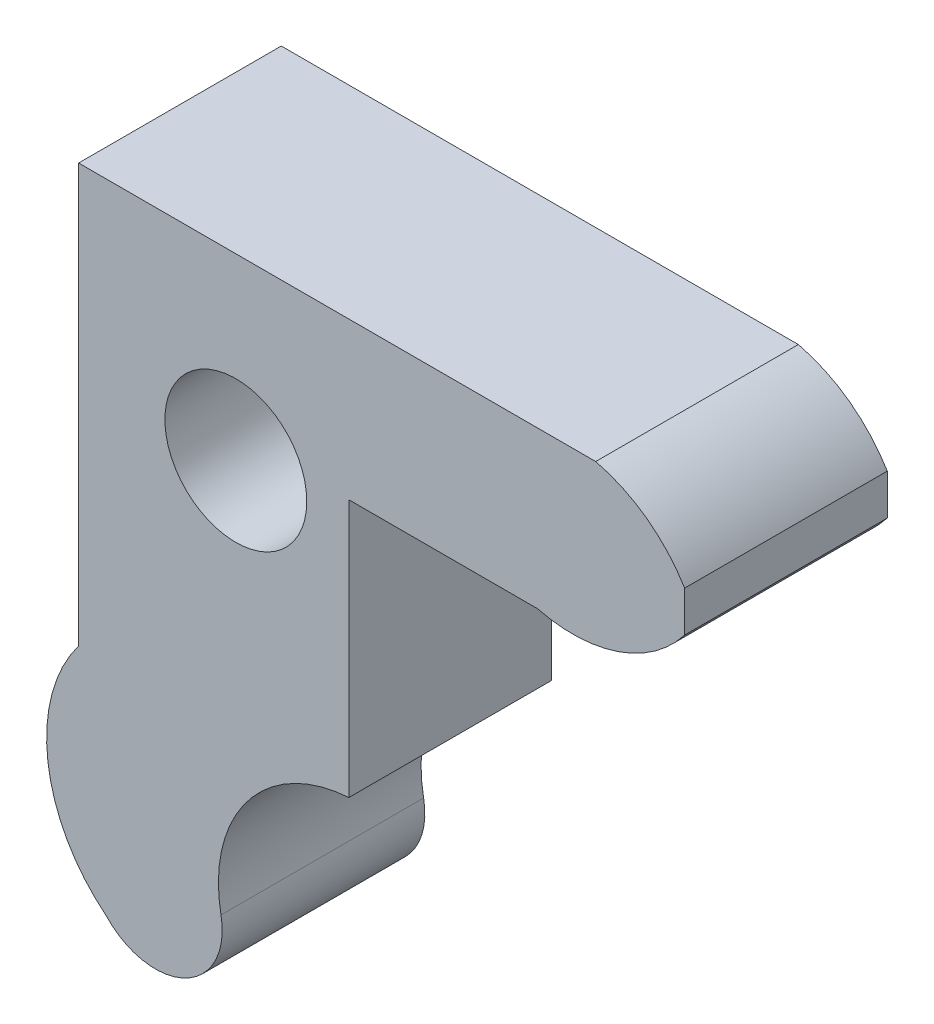
ISO-10303-21;
HEADER;
FILE_DESCRIPTION(('STEP AP214'),'2;1');
FILE_NAME('part.step','',(''),(''),'','','');
FILE_SCHEMA(('AUTOMOTIVE_DESIGN { 1 0 10303 214 1 1 1 1 }'));
ENDSEC;
DATA;
#1=APPLICATION_CONTEXT('core data for automotive mechanical design processes');
#2=APPLICATION_PROTOCOL_DEFINITION('international standard','automotive_design',2000,#1);
#3=PRODUCT_CONTEXT('',#1,'mechanical');
#4=PRODUCT('Part','Part','',(#3));
#5=PRODUCT_RELATED_PRODUCT_CATEGORY('part','',(#4));
#6=PRODUCT_DEFINITION_FORMATION('','',#4);
#7=PRODUCT_DEFINITION_CONTEXT('part definition',#1,'design');
#8=PRODUCT_DEFINITION('design','',#6,#7);
#9=PRODUCT_DEFINITION_SHAPE('','',#8);
#10=(LENGTH_UNIT() NAMED_UNIT(*) SI_UNIT(.MILLI.,.METRE.));
#11=(NAMED_UNIT(*) PLANE_ANGLE_UNIT() SI_UNIT($,.RADIAN.));
#12=(NAMED_UNIT(*) SI_UNIT($,.STERADIAN.) SOLID_ANGLE_UNIT());
#13=UNCERTAINTY_MEASURE_WITH_UNIT(LENGTH_MEASURE(1.E-05),#10,'distance_accuracy_value','');
#14=(GEOMETRIC_REPRESENTATION_CONTEXT(3) GLOBAL_UNCERTAINTY_ASSIGNED_CONTEXT((#13)) GLOBAL_UNIT_ASSIGNED_CONTEXT((#10,
#11,#12)) REPRESENTATION_CONTEXT('',''));
#15=CARTESIAN_POINT('',(0.,0.,0.));
#16=DIRECTION('',(0.,0.,1.));
#17=DIRECTION('',(1.,0.,0.));
#18=AXIS2_PLACEMENT_3D('',#15,#16,#17);
#19=CARTESIAN_POINT('',(-0.885520710545655,-9.91418006301445,3.));
#20=DIRECTION('',(0.,0.,1.));
#21=DIRECTION('',(1.,0.,0.));
#22=AXIS2_PLACEMENT_3D('',#19,#20,#21);
#23=PLANE('',#22);
#24=CARTESIAN_POINT('',(-0.885520710545655,-9.91418006301445,3.));
#25=DIRECTION('',(0.,0.,1.));
#26=DIRECTION('',(1.,0.,0.));
#27=AXIS2_PLACEMENT_3D('',#24,#25,#26);
#28=CIRCLE('',#27,4.71592602186394);
#29=CARTESIAN_POINT('',(-4.65466217372821,-7.07983165919895,3.));
#30=VERTEX_POINT('',#29);
#31=CARTESIAN_POINT('',(-3.83002531609919,-13.5979079128382,3.));
#32=VERTEX_POINT('',#31);
#33=EDGE_CURVE('E161',#30,#32,#28,.T.);
#34=ORIENTED_EDGE('',*,*,#33,.T.);
#35=CARTESIAN_POINT('',(-2.38109806838179,-12.2515628020871,3.));
#36=DIRECTION('',(0.,0.,1.));
#37=DIRECTION('',(1.,0.,0.));
#38=AXIS2_PLACEMENT_3D('',#35,#36,#37);
#39=CIRCLE('',#38,1.97788658077794);
#40=CARTESIAN_POINT('',(-0.439769501258131,-11.8730410446,3.));
#41=VERTEX_POINT('',#40);
#42=EDGE_CURVE('E99',#32,#41,#39,.T.);
#43=ORIENTED_EDGE('',*,*,#42,.T.);
#44=CARTESIAN_POINT('',(3.60750377075866,-11.0839005467481,3.));
#45=DIRECTION('',(0.,0.,-1.));
#46=DIRECTION('',(-1.,0.,0.));
#47=AXIS2_PLACEMENT_3D('',#44,#45,#46);
#48=CIRCLE('',#47,4.12348925835044);
#49=CARTESIAN_POINT('',(3.34533782627179,-6.9687538080178,3.));
#50=VERTEX_POINT('',#49);
#51=EDGE_CURVE('E182',#41,#50,#48,.T.);
#52=ORIENTED_EDGE('',*,*,#51,.T.);
#53=DIRECTION('',(0.,1.,0.));
#54=VECTOR('',#53,1.);
#55=CARTESIAN_POINT('',(3.34533782627179,0.667243239804023,3.));
#56=LINE('',#55,#54);
#57=CARTESIAN_POINT('',(3.34533782627179,0.667243239804023,3.));
#58=VERTEX_POINT('',#57);
#59=EDGE_CURVE('E201',#50,#58,#56,.T.);
#60=ORIENTED_EDGE('',*,*,#59,.T.);
#61=DIRECTION('',(1.,0.,0.));
#62=VECTOR('',#61,1.);
#63=CARTESIAN_POINT('',(8.92787451809538,0.667243239804023,3.));
#64=LINE('',#63,#62);
#65=CARTESIAN_POINT('',(8.92787451809538,0.667243239804024,3.));
#66=VERTEX_POINT('',#65);
#67=EDGE_CURVE('E198',#58,#66,#64,.T.);
#68=ORIENTED_EDGE('',*,*,#67,.T.);
#69=CARTESIAN_POINT('',(9.96942852923801,4.7254002990365,3.));
#70=DIRECTION('',(0.,0.,1.));
#71=DIRECTION('',(1.,0.,0.));
#72=AXIS2_PLACEMENT_3D('',#69,#70,#71);
#73=CIRCLE('',#72,4.18968656053477);
#74=CARTESIAN_POINT('',(13.2887402103993,2.16890984553738,3.));
#75=VERTEX_POINT('',#74);
#76=EDGE_CURVE('E200',#66,#75,#73,.T.);
#77=ORIENTED_EDGE('',*,*,#76,.T.);
#78=DIRECTION('',(0.,1.,0.));
#79=VECTOR('',#78,1.);
#80=CARTESIAN_POINT('',(13.2887402103993,3.37273309343224,3.));
#81=LINE('',#80,#79);
#82=CARTESIAN_POINT('',(13.2887402103993,3.37273309343224,3.));
#83=VERTEX_POINT('',#82);
#84=EDGE_CURVE('E124',#75,#83,#81,.T.);
#85=ORIENTED_EDGE('',*,*,#84,.T.);
#86=CARTESIAN_POINT('',(9.65557150366524,1.17481381956794,3.));
#87=DIRECTION('',(0.,0.,1.));
#88=DIRECTION('',(-1.,0.,0.));
#89=AXIS2_PLACEMENT_3D('',#86,#87,#88);
#90=CIRCLE('',#89,4.24626470983799);
#91=CARTESIAN_POINT('',(10.6551453191726,5.30175168842028,3.));
#92=VERTEX_POINT('',#91);
#93=EDGE_CURVE('E118',#83,#92,#90,.T.);
#94=ORIENTED_EDGE('',*,*,#93,.T.);
#95=DIRECTION('',(-1.,0.,0.));
#96=VECTOR('',#95,1.);
#97=CARTESIAN_POINT('',(-4.65466217372821,5.30175168842028,3.));
#98=LINE('',#97,#96);
#99=CARTESIAN_POINT('',(-4.65466217372821,5.30175168842028,3.));
#100=VERTEX_POINT('',#99);
#101=EDGE_CURVE('E122',#92,#100,#98,.T.);
#102=ORIENTED_EDGE('',*,*,#101,.T.);
#103=DIRECTION('',(0.,-1.,0.));
#104=VECTOR('',#103,1.);
#105=CARTESIAN_POINT('',(-4.65466217372821,-7.07983165919895,3.));
#106=LINE('',#105,#104);
#107=EDGE_CURVE('E50',#100,#30,#106,.T.);
#108=ORIENTED_EDGE('',*,*,#107,.T.);
#109=EDGE_LOOP('',(#34,#43,#52,#60,#68,#77,#85,#94,#102,#108));
#110=FACE_BOUND('',#109,.T.);
#111=CARTESIAN_POINT('',(0.,0.,3.));
#112=DIRECTION('',(0.,0.,1.));
#113=DIRECTION('',(1.,0.,0.));
#114=AXIS2_PLACEMENT_3D('',#111,#112,#113);
#115=CIRCLE('',#114,2.1);
#116=CARTESIAN_POINT('',(2.1,0.,3.));
#117=VERTEX_POINT('',#116);
#118=EDGE_CURVE('E146',#117,#117,#115,.T.);
#119=ORIENTED_EDGE('',*,*,#118,.F.);
#120=EDGE_LOOP('',(#119));
#121=FACE_BOUND('',#120,.T.);
#122=ADVANCED_FACE('F33',(#110,#121),#23,.T.);
#123=CARTESIAN_POINT('',(-0.885520710545655,-9.91418006301445,-3.));
#124=DIRECTION('',(0.,0.,1.));
#125=DIRECTION('',(1.,0.,0.));
#126=AXIS2_PLACEMENT_3D('',#123,#124,#125);
#127=PLANE('',#126);
#128=CARTESIAN_POINT('',(-0.885520710545655,-9.91418006301445,-3.));
#129=DIRECTION('',(0.,0.,1.));
#130=DIRECTION('',(1.,0.,0.));
#131=AXIS2_PLACEMENT_3D('',#128,#129,#130);
#132=CIRCLE('',#131,4.71592602186394);
#133=CARTESIAN_POINT('',(-4.65466217372821,-7.07983165919895,-3.));
#134=VERTEX_POINT('',#133);
#135=CARTESIAN_POINT('',(-3.83002531609919,-13.5979079128382,-3.));
#136=VERTEX_POINT('',#135);
#137=EDGE_CURVE('E142',#134,#136,#132,.T.);
#138=ORIENTED_EDGE('',*,*,#137,.F.);
#139=DIRECTION('',(0.,-1.,0.));
#140=VECTOR('',#139,1.);
#141=CARTESIAN_POINT('',(-4.65466217372821,-7.07983165919895,-3.));
#142=LINE('',#141,#140);
#143=CARTESIAN_POINT('',(-4.65466217372821,5.30175168842028,-3.));
#144=VERTEX_POINT('',#143);
#145=EDGE_CURVE('E91',#144,#134,#142,.T.);
#146=ORIENTED_EDGE('',*,*,#145,.F.);
#147=DIRECTION('',(-1.,0.,0.));
#148=VECTOR('',#147,1.);
#149=CARTESIAN_POINT('',(-4.65466217372821,5.30175168842028,-3.));
#150=LINE('',#149,#148);
#151=CARTESIAN_POINT('',(10.6551453191726,5.30175168842028,-3.));
#152=VERTEX_POINT('',#151);
#153=EDGE_CURVE('E85',#152,#144,#150,.T.);
#154=ORIENTED_EDGE('',*,*,#153,.F.);
#155=CARTESIAN_POINT('',(9.65557150366524,1.17481381956794,-3.));
#156=DIRECTION('',(0.,0.,1.));
#157=DIRECTION('',(-1.,0.,0.));
#158=AXIS2_PLACEMENT_3D('',#155,#156,#157);
#159=CIRCLE('',#158,4.24626470983799);
#160=CARTESIAN_POINT('',(13.2887402103993,3.37273309343224,-3.));
#161=VERTEX_POINT('',#160);
#162=EDGE_CURVE('E132',#161,#152,#159,.T.);
#163=ORIENTED_EDGE('',*,*,#162,.F.);
#164=DIRECTION('',(0.,1.,0.));
#165=VECTOR('',#164,1.);
#166=CARTESIAN_POINT('',(13.2887402103993,3.37273309343224,-3.));
#167=LINE('',#166,#165);
#168=CARTESIAN_POINT('',(13.2887402103993,2.16890984553738,-3.));
#169=VERTEX_POINT('',#168);
#170=EDGE_CURVE('E156',#169,#161,#167,.T.);
#171=ORIENTED_EDGE('',*,*,#170,.F.);
#172=CARTESIAN_POINT('',(9.96942852923801,4.7254002990365,-3.));
#173=DIRECTION('',(0.,0.,1.));
#174=DIRECTION('',(1.,0.,0.));
#175=AXIS2_PLACEMENT_3D('',#172,#173,#174);
#176=CIRCLE('',#175,4.18968656053477);
#177=CARTESIAN_POINT('',(8.92787451809538,0.667243239804024,-3.));
#178=VERTEX_POINT('',#177);
#179=EDGE_CURVE('E154',#178,#169,#176,.T.);
#180=ORIENTED_EDGE('',*,*,#179,.F.);
#181=DIRECTION('',(1.,0.,0.));
#182=VECTOR('',#181,1.);
#183=CARTESIAN_POINT('',(8.92787451809538,0.667243239804023,-3.));
#184=LINE('',#183,#182);
#185=CARTESIAN_POINT('',(3.34533782627179,0.667243239804023,-3.));
#186=VERTEX_POINT('',#185);
#187=EDGE_CURVE('E152',#186,#178,#184,.T.);
#188=ORIENTED_EDGE('',*,*,#187,.F.);
#189=DIRECTION('',(0.,1.,0.));
#190=VECTOR('',#189,1.);
#191=CARTESIAN_POINT('',(3.34533782627179,0.667243239804023,-3.));
#192=LINE('',#191,#190);
#193=CARTESIAN_POINT('',(3.34533782627179,-6.9687538080178,-3.));
#194=VERTEX_POINT('',#193);
#195=EDGE_CURVE('E150',#194,#186,#192,.T.);
#196=ORIENTED_EDGE('',*,*,#195,.F.);
#197=CARTESIAN_POINT('',(3.60750377075866,-11.0839005467481,-3.));
#198=DIRECTION('',(0.,0.,-1.));
#199=DIRECTION('',(-1.,0.,0.));
#200=AXIS2_PLACEMENT_3D('',#197,#198,#199);
#201=CIRCLE('',#200,4.12348925835044);
#202=CARTESIAN_POINT('',(-0.439769501258131,-11.8730410446,-3.));
#203=VERTEX_POINT('',#202);
#204=EDGE_CURVE('E148',#203,#194,#201,.T.);
#205=ORIENTED_EDGE('',*,*,#204,.F.);
#206=CARTESIAN_POINT('',(-2.38109806838179,-12.2515628020871,-3.));
#207=DIRECTION('',(0.,0.,1.));
#208=DIRECTION('',(1.,0.,0.));
#209=AXIS2_PLACEMENT_3D('',#206,#207,#208);
#210=CIRCLE('',#209,1.97788658077794);
#211=EDGE_CURVE('E145',#136,#203,#210,.T.);
#212=ORIENTED_EDGE('',*,*,#211,.F.);
#213=EDGE_LOOP('',(#138,#146,#154,#163,#171,#180,#188,#196,#205,#212));
#214=FACE_BOUND('',#213,.T.);
#215=CARTESIAN_POINT('',(0.,0.,-3.));
#216=DIRECTION('',(0.,0.,1.));
#217=DIRECTION('',(1.,0.,0.));
#218=AXIS2_PLACEMENT_3D('',#215,#216,#217);
#219=CIRCLE('',#218,2.1);
#220=CARTESIAN_POINT('',(2.1,0.,-3.));
#221=VERTEX_POINT('',#220);
#222=EDGE_CURVE('E209',#221,#221,#219,.T.);
#223=ORIENTED_EDGE('',*,*,#222,.T.);
#224=EDGE_LOOP('',(#223));
#225=FACE_BOUND('',#224,.T.);
#226=ADVANCED_FACE('F186',(#214,#225),#127,.F.);
#227=CARTESIAN_POINT('',(-0.885520710545655,-9.91418006301445,3.));
#228=DIRECTION('',(0.,0.,-1.));
#229=DIRECTION('',(-1.,0.,0.));
#230=AXIS2_PLACEMENT_3D('',#227,#228,#229);
#231=CYLINDRICAL_SURFACE('',#230,4.71592602186394);
#232=ORIENTED_EDGE('',*,*,#137,.T.);
#233=DIRECTION('',(0.,0.,-1.));
#234=VECTOR('',#233,1.);
#235=CARTESIAN_POINT('',(-3.83002531609919,-13.5979079128382,3.));
#236=LINE('',#235,#234);
#237=EDGE_CURVE('E11',#32,#136,#236,.T.);
#238=ORIENTED_EDGE('',*,*,#237,.F.);
#239=ORIENTED_EDGE('',*,*,#33,.F.);
#240=DIRECTION('',(0.,0.,-1.));
#241=VECTOR('',#240,1.);
#242=CARTESIAN_POINT('',(-4.65466217372821,-7.07983165919895,3.));
#243=LINE('',#242,#241);
#244=EDGE_CURVE('E138',#30,#134,#243,.T.);
#245=ORIENTED_EDGE('',*,*,#244,.T.);
#246=EDGE_LOOP('',(#232,#238,#239,#245));
#247=FACE_BOUND('',#246,.T.);
#248=ADVANCED_FACE('F35',(#247),#231,.T.);
#249=CARTESIAN_POINT('',(-2.38109806838179,-12.2515628020871,3.));
#250=DIRECTION('',(0.,0.,-1.));
#251=DIRECTION('',(-1.,0.,0.));
#252=AXIS2_PLACEMENT_3D('',#249,#250,#251);
#253=CYLINDRICAL_SURFACE('',#252,1.97788658077794);
#254=ORIENTED_EDGE('',*,*,#211,.T.);
#255=DIRECTION('',(0.,0.,-1.));
#256=VECTOR('',#255,1.);
#257=CARTESIAN_POINT('',(-0.439769501258131,-11.8730410446,3.));
#258=LINE('',#257,#256);
#259=EDGE_CURVE('E42',#41,#203,#258,.T.);
#260=ORIENTED_EDGE('',*,*,#259,.F.);
#261=ORIENTED_EDGE('',*,*,#42,.F.);
#262=ORIENTED_EDGE('',*,*,#237,.T.);
#263=EDGE_LOOP('',(#254,#260,#261,#262));
#264=FACE_BOUND('',#263,.T.);
#265=ADVANCED_FACE('F245',(#264),#253,.T.);
#266=CARTESIAN_POINT('',(3.60750377075866,-11.0839005467481,3.));
#267=DIRECTION('',(0.,0.,-1.));
#268=DIRECTION('',(-1.,0.,0.));
#269=AXIS2_PLACEMENT_3D('',#266,#267,#268);
#270=CYLINDRICAL_SURFACE('',#269,4.12348925835044);
#271=ORIENTED_EDGE('',*,*,#204,.T.);
#272=DIRECTION('',(0.,0.,-1.));
#273=VECTOR('',#272,1.);
#274=CARTESIAN_POINT('',(3.34533782627179,-6.9687538080178,3.));
#275=LINE('',#274,#273);
#276=EDGE_CURVE('E174',#50,#194,#275,.T.);
#277=ORIENTED_EDGE('',*,*,#276,.F.);
#278=ORIENTED_EDGE('',*,*,#51,.F.);
#279=ORIENTED_EDGE('',*,*,#259,.T.);
#280=EDGE_LOOP('',(#271,#277,#278,#279));
#281=FACE_BOUND('',#280,.T.);
#282=ADVANCED_FACE('F180',(#281),#270,.F.);
#283=CARTESIAN_POINT('',(3.34533782627179,0.667243239804023,3.));
#284=DIRECTION('',(-1.,0.,0.));
#285=DIRECTION('',(0.,-1.,0.));
#286=AXIS2_PLACEMENT_3D('',#283,#284,#285);
#287=PLANE('',#286);
#288=ORIENTED_EDGE('',*,*,#195,.T.);
#289=DIRECTION('',(0.,0.,-1.));
#290=VECTOR('',#289,1.);
#291=CARTESIAN_POINT('',(3.34533782627179,0.667243239804023,3.));
#292=LINE('',#291,#290);
#293=EDGE_CURVE('E171',#58,#186,#292,.T.);
#294=ORIENTED_EDGE('',*,*,#293,.F.);
#295=ORIENTED_EDGE('',*,*,#59,.F.);
#296=ORIENTED_EDGE('',*,*,#276,.T.);
#297=EDGE_LOOP('',(#288,#294,#295,#296));
#298=FACE_BOUND('',#297,.T.);
#299=ADVANCED_FACE('F192',(#298),#287,.F.);
#300=CARTESIAN_POINT('',(8.92787451809538,0.667243239804023,3.));
#301=DIRECTION('',(0.,1.,0.));
#302=DIRECTION('',(-1.,0.,0.));
#303=AXIS2_PLACEMENT_3D('',#300,#301,#302);
#304=PLANE('',#303);
#305=ORIENTED_EDGE('',*,*,#187,.T.);
#306=DIRECTION('',(0.,0.,-1.));
#307=VECTOR('',#306,1.);
#308=CARTESIAN_POINT('',(8.92787451809538,0.667243239804024,3.));
#309=LINE('',#308,#307);
#310=EDGE_CURVE('E168',#66,#178,#309,.T.);
#311=ORIENTED_EDGE('',*,*,#310,.F.);
#312=ORIENTED_EDGE('',*,*,#67,.F.);
#313=ORIENTED_EDGE('',*,*,#293,.T.);
#314=EDGE_LOOP('',(#305,#311,#312,#313));
#315=FACE_BOUND('',#314,.T.);
#316=ADVANCED_FACE('F196',(#315),#304,.F.);
#317=CARTESIAN_POINT('',(9.96942852923801,4.7254002990365,3.));
#318=DIRECTION('',(0.,0.,-1.));
#319=DIRECTION('',(-1.,0.,0.));
#320=AXIS2_PLACEMENT_3D('',#317,#318,#319);
#321=CYLINDRICAL_SURFACE('',#320,4.18968656053477);
#322=ORIENTED_EDGE('',*,*,#179,.T.);
#323=DIRECTION('',(0.,0.,-1.));
#324=VECTOR('',#323,1.);
#325=CARTESIAN_POINT('',(13.2887402103993,2.16890984553738,3.));
#326=LINE('',#325,#324);
#327=EDGE_CURVE('E165',#75,#169,#326,.T.);
#328=ORIENTED_EDGE('',*,*,#327,.F.);
#329=ORIENTED_EDGE('',*,*,#76,.F.);
#330=ORIENTED_EDGE('',*,*,#310,.T.);
#331=EDGE_LOOP('',(#322,#328,#329,#330));
#332=FACE_BOUND('',#331,.T.);
#333=ADVANCED_FACE('F235',(#332),#321,.T.);
#334=CARTESIAN_POINT('',(13.2887402103993,3.37273309343224,3.));
#335=DIRECTION('',(-1.,0.,0.));
#336=DIRECTION('',(0.,-1.,0.));
#337=AXIS2_PLACEMENT_3D('',#334,#335,#336);
#338=PLANE('',#337);
#339=ORIENTED_EDGE('',*,*,#170,.T.);
#340=DIRECTION('',(0.,0.,-1.));
#341=VECTOR('',#340,1.);
#342=CARTESIAN_POINT('',(13.2887402103993,3.37273309343224,3.));
#343=LINE('',#342,#341);
#344=EDGE_CURVE('E133',#83,#161,#343,.T.);
#345=ORIENTED_EDGE('',*,*,#344,.F.);
#346=ORIENTED_EDGE('',*,*,#84,.F.);
#347=ORIENTED_EDGE('',*,*,#327,.T.);
#348=EDGE_LOOP('',(#339,#345,#346,#347));
#349=FACE_BOUND('',#348,.T.);
#350=ADVANCED_FACE('F232',(#349),#338,.F.);
#351=CARTESIAN_POINT('',(9.65557150366524,1.17481381956794,3.));
#352=DIRECTION('',(0.,0.,-1.));
#353=DIRECTION('',(-1.,0.,0.));
#354=AXIS2_PLACEMENT_3D('',#351,#352,#353);
#355=CYLINDRICAL_SURFACE('',#354,4.24626470983799);
#356=ORIENTED_EDGE('',*,*,#162,.T.);
#357=DIRECTION('',(0.,0.,-1.));
#358=VECTOR('',#357,1.);
#359=CARTESIAN_POINT('',(10.6551453191726,5.30175168842028,3.));
#360=LINE('',#359,#358);
#361=EDGE_CURVE('E129',#92,#152,#360,.T.);
#362=ORIENTED_EDGE('',*,*,#361,.F.);
#363=ORIENTED_EDGE('',*,*,#93,.F.);
#364=ORIENTED_EDGE('',*,*,#344,.T.);
#365=EDGE_LOOP('',(#356,#362,#363,#364));
#366=FACE_BOUND('',#365,.T.);
#367=ADVANCED_FACE('F130',(#366),#355,.T.);
#368=CARTESIAN_POINT('',(-4.65466217372821,5.30175168842028,3.));
#369=DIRECTION('',(0.,-1.,0.));
#370=DIRECTION('',(0.,0.,-1.));
#371=AXIS2_PLACEMENT_3D('',#368,#369,#370);
#372=PLANE('',#371);
#373=ORIENTED_EDGE('',*,*,#153,.T.);
#374=DIRECTION('',(0.,0.,-1.));
#375=VECTOR('',#374,1.);
#376=CARTESIAN_POINT('',(-4.65466217372821,5.30175168842028,3.));
#377=LINE('',#376,#375);
#378=EDGE_CURVE('E134',#100,#144,#377,.T.);
#379=ORIENTED_EDGE('',*,*,#378,.F.);
#380=ORIENTED_EDGE('',*,*,#101,.F.);
#381=ORIENTED_EDGE('',*,*,#361,.T.);
#382=EDGE_LOOP('',(#373,#379,#380,#381));
#383=FACE_BOUND('',#382,.T.);
#384=ADVANCED_FACE('F136',(#383),#372,.F.);
#385=CARTESIAN_POINT('',(-4.65466217372821,-7.07983165919895,3.));
#386=DIRECTION('',(1.,0.,0.));
#387=DIRECTION('',(0.,0.,-1.));
#388=AXIS2_PLACEMENT_3D('',#385,#386,#387);
#389=PLANE('',#388);
#390=ORIENTED_EDGE('',*,*,#145,.T.);
#391=ORIENTED_EDGE('',*,*,#244,.F.);
#392=ORIENTED_EDGE('',*,*,#107,.F.);
#393=ORIENTED_EDGE('',*,*,#378,.T.);
#394=EDGE_LOOP('',(#390,#391,#392,#393));
#395=FACE_BOUND('',#394,.T.);
#396=ADVANCED_FACE('F225',(#395),#389,.F.);
#397=CARTESIAN_POINT('',(0.,0.,3.));
#398=DIRECTION('',(0.,0.,-1.));
#399=DIRECTION('',(-1.,0.,0.));
#400=AXIS2_PLACEMENT_3D('',#397,#398,#399);
#401=CYLINDRICAL_SURFACE('',#400,2.1);
#402=ORIENTED_EDGE('',*,*,#118,.T.);
#403=EDGE_LOOP('',(#402));
#404=FACE_BOUND('',#403,.T.);
#405=ORIENTED_EDGE('',*,*,#222,.F.);
#406=EDGE_LOOP('',(#405));
#407=FACE_BOUND('',#406,.T.);
#408=ADVANCED_FACE('F215',(#404,#407),#401,.F.);
#409=CLOSED_SHELL('',(#122,#226,#248,#265,#282,#299,#316,#333,#350,#367,#384,#396,#408));
#410=MANIFOLD_SOLID_BREP('B2',#409);
#411=ADVANCED_BREP_SHAPE_REPRESENTATION('',(#18,#410),#14);
#412=SHAPE_DEFINITION_REPRESENTATION(#9,#411);
ENDSEC;
END-ISO-10303-21;
